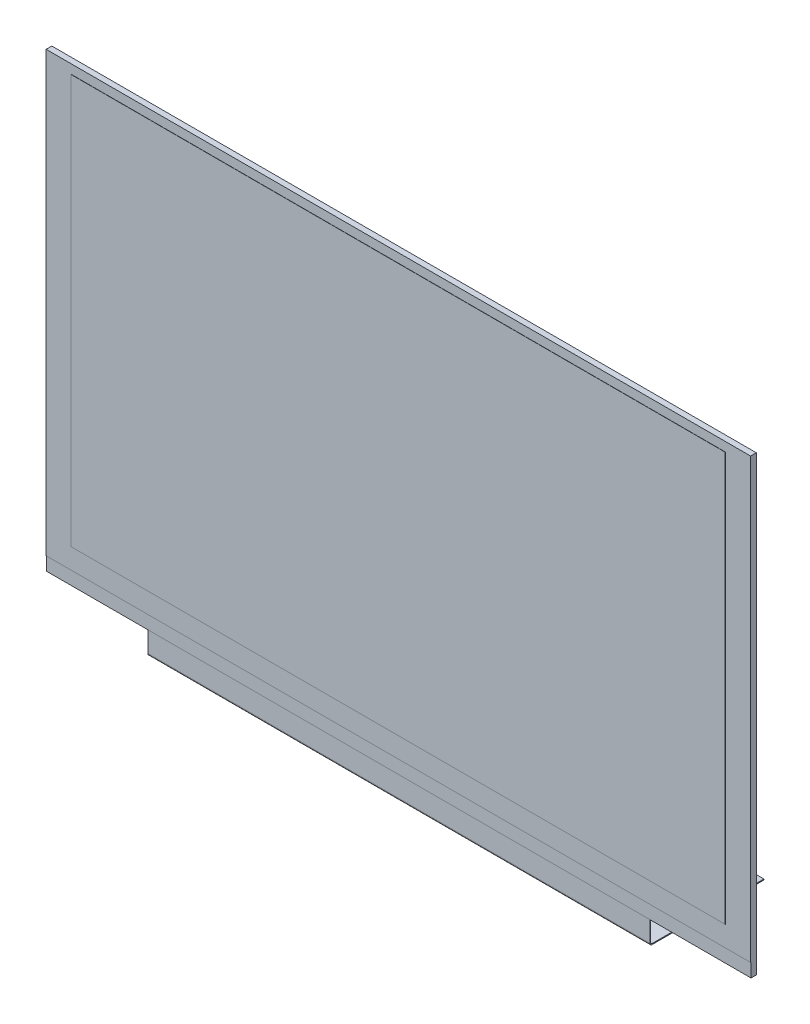
ISO-10303-21;
HEADER;
FILE_DESCRIPTION(('STEP AP214'),'2;1');
FILE_NAME('part.step','',(''),(''),'','','');
FILE_SCHEMA(('AUTOMOTIVE_DESIGN { 1 0 10303 214 1 1 1 1 }'));
ENDSEC;
DATA;
#1=APPLICATION_CONTEXT('core data for automotive mechanical design processes');
#2=APPLICATION_PROTOCOL_DEFINITION('international standard','automotive_design',2000,#1);
#3=PRODUCT_CONTEXT('',#1,'mechanical');
#4=PRODUCT('Part','Part','',(#3));
#5=PRODUCT_RELATED_PRODUCT_CATEGORY('part','',(#4));
#6=PRODUCT_DEFINITION_FORMATION('','',#4);
#7=PRODUCT_DEFINITION_CONTEXT('part definition',#1,'design');
#8=PRODUCT_DEFINITION('design','',#6,#7);
#9=PRODUCT_DEFINITION_SHAPE('','',#8);
#10=(LENGTH_UNIT() NAMED_UNIT(*) SI_UNIT(.MILLI.,.METRE.));
#11=(NAMED_UNIT(*) PLANE_ANGLE_UNIT() SI_UNIT($,.RADIAN.));
#12=(NAMED_UNIT(*) SI_UNIT($,.STERADIAN.) SOLID_ANGLE_UNIT());
#13=UNCERTAINTY_MEASURE_WITH_UNIT(LENGTH_MEASURE(1.E-05),#10,'distance_accuracy_value','');
#14=(GEOMETRIC_REPRESENTATION_CONTEXT(3) GLOBAL_UNCERTAINTY_ASSIGNED_CONTEXT((#13)) GLOBAL_UNIT_ASSIGNED_CONTEXT((#10,
#11,#12)) REPRESENTATION_CONTEXT('',''));
#15=CARTESIAN_POINT('',(0.,0.,0.));
#16=DIRECTION('',(0.,0.,1.));
#17=DIRECTION('',(1.,0.,0.));
#18=AXIS2_PLACEMENT_3D('',#15,#16,#17);
#19=CARTESIAN_POINT('',(-55.,-54.05,0.649999999999999));
#20=DIRECTION('',(1.,0.,0.));
#21=DIRECTION('',(0.,0.,-1.));
#22=AXIS2_PLACEMENT_3D('',#19,#20,#21);
#23=CYLINDRICAL_SURFACE('',#22,0.3);
#24=DIRECTION('',(1.,0.,0.));
#25=VECTOR('',#24,1.);
#26=CARTESIAN_POINT('',(-55.,-54.35,0.65));
#27=LINE('',#26,#25);
#28=CARTESIAN_POINT('',(55.,-54.35,0.65));
#29=VERTEX_POINT('',#28);
#30=CARTESIAN_POINT('',(-55.,-54.35,0.65));
#31=VERTEX_POINT('',#30);
#32=EDGE_CURVE('P0_E131',#29,#31,#27,.F.);
#33=ORIENTED_EDGE('',*,*,#32,.T.);
#34=CARTESIAN_POINT('',(-55.,-54.05,0.649999999999999));
#35=DIRECTION('',(1.,0.,0.));
#36=DIRECTION('',(0.,0.,-1.));
#37=AXIS2_PLACEMENT_3D('',#34,#35,#36);
#38=CIRCLE('',#37,0.3);
#39=CARTESIAN_POINT('',(-55.,-54.05,0.95));
#40=VERTEX_POINT('',#39);
#41=EDGE_CURVE('P0_E19',#40,#31,#38,.T.);
#42=ORIENTED_EDGE('',*,*,#41,.F.);
#43=DIRECTION('',(1.,0.,0.));
#44=VECTOR('',#43,1.);
#45=CARTESIAN_POINT('',(-55.,-54.05,0.95));
#46=LINE('',#45,#44);
#47=CARTESIAN_POINT('',(55.,-54.05,0.95));
#48=VERTEX_POINT('',#47);
#49=EDGE_CURVE('P0_E191',#40,#48,#46,.T.);
#50=ORIENTED_EDGE('',*,*,#49,.T.);
#51=CARTESIAN_POINT('',(55.,-54.05,0.649999999999999));
#52=DIRECTION('',(1.,0.,0.));
#53=DIRECTION('',(0.,0.,-1.));
#54=AXIS2_PLACEMENT_3D('',#51,#52,#53);
#55=CIRCLE('',#54,0.3);
#56=EDGE_CURVE('P0_E235',#29,#48,#55,.F.);
#57=ORIENTED_EDGE('',*,*,#56,.F.);
#58=EDGE_LOOP('',(#33,#42,#50,#57));
#59=FACE_BOUND('',#58,.T.);
#60=ADVANCED_FACE('P0_F16',(#59),#23,.F.);
#61=CARTESIAN_POINT('',(-52.5,-53.05,-23.85));
#62=DIRECTION('',(-1.,0.,0.));
#63=DIRECTION('',(0.,0.,1.));
#64=AXIS2_PLACEMENT_3D('',#61,#62,#63);
#65=PLANE('',#64);
#66=DIRECTION('',(0.,1.,0.));
#67=VECTOR('',#66,1.);
#68=CARTESIAN_POINT('',(-52.5,-53.05,-19.85));
#69=LINE('',#68,#67);
#70=CARTESIAN_POINT('',(-52.5,-53.05,-19.85));
#71=VERTEX_POINT('',#70);
#72=CARTESIAN_POINT('',(-52.5,-54.35,-19.85));
#73=VERTEX_POINT('',#72);
#74=EDGE_CURVE('P0_E223',#71,#73,#69,.F.);
#75=ORIENTED_EDGE('',*,*,#74,.F.);
#76=DIRECTION('',(0.,0.,-1.));
#77=VECTOR('',#76,1.);
#78=CARTESIAN_POINT('',(-52.5,-53.05,0.));
#79=LINE('',#78,#77);
#80=CARTESIAN_POINT('',(-52.5,-53.05,-23.85));
#81=VERTEX_POINT('',#80);
#82=EDGE_CURVE('P0_E240',#71,#81,#79,.T.);
#83=ORIENTED_EDGE('',*,*,#82,.T.);
#84=DIRECTION('',(0.,1.,0.));
#85=VECTOR('',#84,1.);
#86=CARTESIAN_POINT('',(-52.5,-53.05,-23.85));
#87=LINE('',#86,#85);
#88=CARTESIAN_POINT('',(-52.5,-54.35,-23.85));
#89=VERTEX_POINT('',#88);
#90=EDGE_CURVE('P0_E231',#81,#89,#87,.F.);
#91=ORIENTED_EDGE('',*,*,#90,.T.);
#92=DIRECTION('',(0.,0.,-1.));
#93=VECTOR('',#92,1.);
#94=CARTESIAN_POINT('',(-52.5,-54.35,0.649999999999999));
#95=LINE('',#94,#93);
#96=EDGE_CURVE('P0_E190',#89,#73,#95,.F.);
#97=ORIENTED_EDGE('',*,*,#96,.T.);
#98=EDGE_LOOP('',(#75,#83,#91,#97));
#99=FACE_BOUND('',#98,.T.);
#100=ADVANCED_FACE('P0_F383',(#99),#65,.T.);
#101=CARTESIAN_POINT('',(-27.5,-53.05,-19.85));
#102=DIRECTION('',(0.,0.,1.));
#103=DIRECTION('',(1.,0.,0.));
#104=AXIS2_PLACEMENT_3D('',#101,#102,#103);
#105=PLANE('',#104);
#106=DIRECTION('',(0.,1.,0.));
#107=VECTOR('',#106,1.);
#108=CARTESIAN_POINT('',(-27.5,-53.05,-19.85));
#109=LINE('',#108,#107);
#110=CARTESIAN_POINT('',(-27.5,-53.05,-19.85));
#111=VERTEX_POINT('',#110);
#112=CARTESIAN_POINT('',(-27.5,-54.35,-19.85));
#113=VERTEX_POINT('',#112);
#114=EDGE_CURVE('P0_E218',#111,#113,#109,.F.);
#115=ORIENTED_EDGE('',*,*,#114,.F.);
#116=DIRECTION('',(1.,0.,0.));
#117=VECTOR('',#116,1.);
#118=CARTESIAN_POINT('',(0.,-53.05,-19.85));
#119=LINE('',#118,#117);
#120=EDGE_CURVE('P0_E214',#111,#71,#119,.F.);
#121=ORIENTED_EDGE('',*,*,#120,.T.);
#122=ORIENTED_EDGE('',*,*,#74,.T.);
#123=DIRECTION('',(1.,0.,0.));
#124=VECTOR('',#123,1.);
#125=CARTESIAN_POINT('',(-55.,-54.35,-19.85));
#126=LINE('',#125,#124);
#127=EDGE_CURVE('P0_E203',#73,#113,#126,.T.);
#128=ORIENTED_EDGE('',*,*,#127,.T.);
#129=EDGE_LOOP('',(#115,#121,#122,#128));
#130=FACE_BOUND('',#129,.T.);
#131=ADVANCED_FACE('P0_F374',(#130),#105,.T.);
#132=CARTESIAN_POINT('',(-27.5,-53.05,-23.85));
#133=DIRECTION('',(1.,0.,0.));
#134=DIRECTION('',(0.,0.,-1.));
#135=AXIS2_PLACEMENT_3D('',#132,#133,#134);
#136=PLANE('',#135);
#137=DIRECTION('',(0.,1.,0.));
#138=VECTOR('',#137,1.);
#139=CARTESIAN_POINT('',(-27.5,-53.05,-23.85));
#140=LINE('',#139,#138);
#141=CARTESIAN_POINT('',(-27.5,-54.35,-23.85));
#142=VERTEX_POINT('',#141);
#143=CARTESIAN_POINT('',(-27.5,-53.05,-23.85));
#144=VERTEX_POINT('',#143);
#145=EDGE_CURVE('P0_E139',#142,#144,#140,.T.);
#146=ORIENTED_EDGE('',*,*,#145,.T.);
#147=DIRECTION('',(0.,0.,-1.));
#148=VECTOR('',#147,1.);
#149=CARTESIAN_POINT('',(-27.5,-53.05,0.));
#150=LINE('',#149,#148);
#151=EDGE_CURVE('P0_E195',#144,#111,#150,.F.);
#152=ORIENTED_EDGE('',*,*,#151,.T.);
#153=ORIENTED_EDGE('',*,*,#114,.T.);
#154=DIRECTION('',(0.,0.,-1.));
#155=VECTOR('',#154,1.);
#156=CARTESIAN_POINT('',(-27.5,-54.35,0.649999999999999));
#157=LINE('',#156,#155);
#158=EDGE_CURVE('P0_E184',#113,#142,#157,.T.);
#159=ORIENTED_EDGE('',*,*,#158,.T.);
#160=EDGE_LOOP('',(#146,#152,#153,#159));
#161=FACE_BOUND('',#160,.T.);
#162=ADVANCED_FACE('P0_F366',(#161),#136,.T.);
#163=CARTESIAN_POINT('',(-55.,-49.55,1.15));
#164=DIRECTION('',(0.,-1.,0.));
#165=DIRECTION('',(0.,0.,-1.));
#166=AXIS2_PLACEMENT_3D('',#163,#164,#165);
#167=PLANE('',#166);
#168=DIRECTION('',(0.,0.,-1.));
#169=VECTOR('',#168,1.);
#170=CARTESIAN_POINT('',(-55.,-49.55,1.15));
#171=LINE('',#170,#169);
#172=CARTESIAN_POINT('',(-55.,-49.55,1.15));
#173=VERTEX_POINT('',#172);
#174=CARTESIAN_POINT('',(-55.,-49.55,0.95));
#175=VERTEX_POINT('',#174);
#176=EDGE_CURVE('P0_E69',#173,#175,#171,.T.);
#177=ORIENTED_EDGE('',*,*,#176,.F.);
#178=DIRECTION('',(1.,0.,0.));
#179=VECTOR('',#178,1.);
#180=CARTESIAN_POINT('',(-55.,-49.55,1.15));
#181=LINE('',#180,#179);
#182=CARTESIAN_POINT('',(55.,-49.55,1.15));
#183=VERTEX_POINT('',#182);
#184=EDGE_CURVE('P0_E177',#183,#173,#181,.F.);
#185=ORIENTED_EDGE('',*,*,#184,.F.);
#186=DIRECTION('',(0.,0.,-1.));
#187=VECTOR('',#186,1.);
#188=CARTESIAN_POINT('',(55.,-49.55,1.15));
#189=LINE('',#188,#187);
#190=CARTESIAN_POINT('',(55.,-49.55,0.95));
#191=VERTEX_POINT('',#190);
#192=EDGE_CURVE('P0_E209',#191,#183,#189,.F.);
#193=ORIENTED_EDGE('',*,*,#192,.F.);
#194=DIRECTION('',(1.,0.,0.));
#195=VECTOR('',#194,1.);
#196=CARTESIAN_POINT('',(-55.,-49.55,0.95));
#197=LINE('',#196,#195);
#198=EDGE_CURVE('P0_E193',#191,#175,#197,.F.);
#199=ORIENTED_EDGE('',*,*,#198,.T.);
#200=EDGE_LOOP('',(#177,#185,#193,#199));
#201=FACE_BOUND('',#200,.T.);
#202=ADVANCED_FACE('P0_F269',(#201),#167,.F.);
#203=CARTESIAN_POINT('',(0.,-53.05,0.));
#204=DIRECTION('',(0.,-1.,0.));
#205=DIRECTION('',(0.,0.,-1.));
#206=AXIS2_PLACEMENT_3D('',#203,#204,#205);
#207=PLANE('',#206);
#208=DIRECTION('',(-1.,0.,0.));
#209=VECTOR('',#208,1.);
#210=CARTESIAN_POINT('',(-27.5,-53.05,-23.85));
#211=LINE('',#210,#209);
#212=EDGE_CURVE('P0_E141',#81,#144,#211,.F.);
#213=ORIENTED_EDGE('',*,*,#212,.F.);
#214=ORIENTED_EDGE('',*,*,#82,.F.);
#215=ORIENTED_EDGE('',*,*,#120,.F.);
#216=ORIENTED_EDGE('',*,*,#151,.F.);
#217=EDGE_LOOP('',(#213,#214,#215,#216));
#218=FACE_BOUND('',#217,.T.);
#219=ADVANCED_FACE('P0_F280',(#218),#207,.F.);
#220=CARTESIAN_POINT('',(-55.,-49.55,0.95));
#221=DIRECTION('',(0.,0.,1.));
#222=DIRECTION('',(0.,-1.,0.));
#223=AXIS2_PLACEMENT_3D('',#220,#221,#222);
#224=PLANE('',#223);
#225=ORIENTED_EDGE('',*,*,#49,.F.);
#226=DIRECTION('',(0.,1.,0.));
#227=VECTOR('',#226,1.);
#228=CARTESIAN_POINT('',(-55.,-54.55,0.95));
#229=LINE('',#228,#227);
#230=EDGE_CURVE('P0_E170',#175,#40,#229,.F.);
#231=ORIENTED_EDGE('',*,*,#230,.F.);
#232=ORIENTED_EDGE('',*,*,#198,.F.);
#233=DIRECTION('',(0.,1.,0.));
#234=VECTOR('',#233,1.);
#235=CARTESIAN_POINT('',(55.,-49.55,0.95));
#236=LINE('',#235,#234);
#237=EDGE_CURVE('P0_E134',#191,#48,#236,.F.);
#238=ORIENTED_EDGE('',*,*,#237,.T.);
#239=EDGE_LOOP('',(#225,#231,#232,#238));
#240=FACE_BOUND('',#239,.T.);
#241=ADVANCED_FACE('P0_F271',(#240),#224,.F.);
#242=CARTESIAN_POINT('',(-55.,-54.35,0.649999999999999));
#243=DIRECTION('',(0.,-1.,0.));
#244=DIRECTION('',(0.,0.,-1.));
#245=AXIS2_PLACEMENT_3D('',#242,#243,#244);
#246=PLANE('',#245);
#247=ORIENTED_EDGE('',*,*,#127,.F.);
#248=ORIENTED_EDGE('',*,*,#96,.F.);
#249=DIRECTION('',(-1.,0.,0.));
#250=VECTOR('',#249,1.);
#251=CARTESIAN_POINT('',(-27.5,-54.35,-23.85));
#252=LINE('',#251,#250);
#253=CARTESIAN_POINT('',(-55.,-54.35,-23.85));
#254=VERTEX_POINT('',#253);
#255=EDGE_CURVE('P0_E169',#254,#89,#252,.F.);
#256=ORIENTED_EDGE('',*,*,#255,.F.);
#257=DIRECTION('',(0.,0.,1.));
#258=VECTOR('',#257,1.);
#259=CARTESIAN_POINT('',(-55.,-54.35,0.649999999999999));
#260=LINE('',#259,#258);
#261=EDGE_CURVE('P0_E167',#31,#254,#260,.F.);
#262=ORIENTED_EDGE('',*,*,#261,.F.);
#263=ORIENTED_EDGE('',*,*,#32,.F.);
#264=DIRECTION('',(0.,0.,1.));
#265=VECTOR('',#264,1.);
#266=CARTESIAN_POINT('',(55.,-54.35,1.15));
#267=LINE('',#266,#265);
#268=CARTESIAN_POINT('',(55.,-54.35,-23.85));
#269=VERTEX_POINT('',#268);
#270=EDGE_CURVE('P0_E124',#29,#269,#267,.F.);
#271=ORIENTED_EDGE('',*,*,#270,.T.);
#272=DIRECTION('',(-1.,0.,0.));
#273=VECTOR('',#272,1.);
#274=CARTESIAN_POINT('',(-27.5,-54.35,-23.85));
#275=LINE('',#274,#273);
#276=EDGE_CURVE('P0_E129',#142,#269,#275,.F.);
#277=ORIENTED_EDGE('',*,*,#276,.F.);
#278=ORIENTED_EDGE('',*,*,#158,.F.);
#279=EDGE_LOOP('',(#247,#248,#256,#262,#263,#271,#277,#278));
#280=FACE_BOUND('',#279,.T.);
#281=ADVANCED_FACE('P0_F127',(#280),#246,.F.);
#282=CARTESIAN_POINT('',(-55.,-49.55,1.15));
#283=DIRECTION('',(0.,0.,1.));
#284=DIRECTION('',(0.,-1.,0.));
#285=AXIS2_PLACEMENT_3D('',#282,#283,#284);
#286=PLANE('',#285);
#287=DIRECTION('',(0.,1.,0.));
#288=VECTOR('',#287,1.);
#289=CARTESIAN_POINT('',(-55.,-54.55,1.15));
#290=LINE('',#289,#288);
#291=CARTESIAN_POINT('',(-55.,-54.05,1.15));
#292=VERTEX_POINT('',#291);
#293=EDGE_CURVE('P0_E107',#292,#173,#290,.T.);
#294=ORIENTED_EDGE('',*,*,#293,.F.);
#295=DIRECTION('',(1.,0.,0.));
#296=VECTOR('',#295,1.);
#297=CARTESIAN_POINT('',(-55.,-54.05,1.15));
#298=LINE('',#297,#296);
#299=CARTESIAN_POINT('',(55.,-54.05,1.15));
#300=VERTEX_POINT('',#299);
#301=EDGE_CURVE('P0_E180',#300,#292,#298,.F.);
#302=ORIENTED_EDGE('',*,*,#301,.F.);
#303=DIRECTION('',(0.,1.,0.));
#304=VECTOR('',#303,1.);
#305=CARTESIAN_POINT('',(55.,-49.55,1.15));
#306=LINE('',#305,#304);
#307=EDGE_CURVE('P0_E146',#300,#183,#306,.T.);
#308=ORIENTED_EDGE('',*,*,#307,.T.);
#309=ORIENTED_EDGE('',*,*,#184,.T.);
#310=EDGE_LOOP('',(#294,#302,#308,#309));
#311=FACE_BOUND('',#310,.T.);
#312=ADVANCED_FACE('P0_F264',(#311),#286,.T.);
#313=CARTESIAN_POINT('',(-55.,-54.55,0.649999999999999));
#314=DIRECTION('',(-1.,0.,0.));
#315=DIRECTION('',(0.,0.,1.));
#316=AXIS2_PLACEMENT_3D('',#313,#314,#315);
#317=PLANE('',#316);
#318=ORIENTED_EDGE('',*,*,#261,.T.);
#319=DIRECTION('',(0.,1.,0.));
#320=VECTOR('',#319,1.);
#321=CARTESIAN_POINT('',(-55.,-53.05,-23.85));
#322=LINE('',#321,#320);
#323=CARTESIAN_POINT('',(-55.,-54.55,-23.85));
#324=VERTEX_POINT('',#323);
#325=EDGE_CURVE('P0_E117',#324,#254,#322,.T.);
#326=ORIENTED_EDGE('',*,*,#325,.F.);
#327=DIRECTION('',(0.,0.,-1.));
#328=VECTOR('',#327,1.);
#329=CARTESIAN_POINT('',(-55.,-54.55,0.));
#330=LINE('',#329,#328);
#331=CARTESIAN_POINT('',(-55.,-54.55,0.649999999999999));
#332=VERTEX_POINT('',#331);
#333=EDGE_CURVE('P0_E112',#332,#324,#330,.T.);
#334=ORIENTED_EDGE('',*,*,#333,.F.);
#335=CARTESIAN_POINT('',(-55.,-54.05,0.649999999999999));
#336=DIRECTION('',(1.,0.,0.));
#337=DIRECTION('',(0.,0.,-1.));
#338=AXIS2_PLACEMENT_3D('',#335,#336,#337);
#339=CIRCLE('',#338,0.5);
#340=EDGE_CURVE('P0_E164',#292,#332,#339,.T.);
#341=ORIENTED_EDGE('',*,*,#340,.F.);
#342=ORIENTED_EDGE('',*,*,#293,.T.);
#343=ORIENTED_EDGE('',*,*,#176,.T.);
#344=ORIENTED_EDGE('',*,*,#230,.T.);
#345=ORIENTED_EDGE('',*,*,#41,.T.);
#346=EDGE_LOOP('',(#318,#326,#334,#341,#342,#343,#344,#345));
#347=FACE_BOUND('',#346,.T.);
#348=ADVANCED_FACE('P0_F256',(#347),#317,.T.);
#349=CARTESIAN_POINT('',(-27.5,-53.05,-23.85));
#350=DIRECTION('',(0.,0.,-1.));
#351=DIRECTION('',(-1.,0.,0.));
#352=AXIS2_PLACEMENT_3D('',#349,#350,#351);
#353=PLANE('',#352);
#354=DIRECTION('',(1.,0.,0.));
#355=VECTOR('',#354,1.);
#356=CARTESIAN_POINT('',(0.,-54.55,-23.85));
#357=LINE('',#356,#355);
#358=CARTESIAN_POINT('',(55.,-54.55,-23.85));
#359=VERTEX_POINT('',#358);
#360=EDGE_CURVE('P0_E156',#324,#359,#357,.T.);
#361=ORIENTED_EDGE('',*,*,#360,.F.);
#362=ORIENTED_EDGE('',*,*,#325,.T.);
#363=ORIENTED_EDGE('',*,*,#255,.T.);
#364=ORIENTED_EDGE('',*,*,#90,.F.);
#365=ORIENTED_EDGE('',*,*,#212,.T.);
#366=ORIENTED_EDGE('',*,*,#145,.F.);
#367=ORIENTED_EDGE('',*,*,#276,.T.);
#368=DIRECTION('',(0.,1.,0.));
#369=VECTOR('',#368,1.);
#370=CARTESIAN_POINT('',(55.,-49.55,-23.85));
#371=LINE('',#370,#369);
#372=EDGE_CURVE('P0_E133',#269,#359,#371,.F.);
#373=ORIENTED_EDGE('',*,*,#372,.T.);
#374=EDGE_LOOP('',(#361,#362,#363,#364,#365,#366,#367,#373));
#375=FACE_BOUND('',#374,.T.);
#376=ADVANCED_FACE('P0_F137',(#375),#353,.T.);
#377=CARTESIAN_POINT('',(55.,-49.55,1.15));
#378=DIRECTION('',(-1.,0.,0.));
#379=DIRECTION('',(0.,0.,1.));
#380=AXIS2_PLACEMENT_3D('',#377,#378,#379);
#381=PLANE('',#380);
#382=CARTESIAN_POINT('',(55.,-54.05,0.649999999999999));
#383=DIRECTION('',(1.,0.,0.));
#384=DIRECTION('',(0.,0.,-1.));
#385=AXIS2_PLACEMENT_3D('',#382,#383,#384);
#386=CIRCLE('',#385,0.5);
#387=CARTESIAN_POINT('',(55.,-54.55,0.649999999999999));
#388=VERTEX_POINT('',#387);
#389=EDGE_CURVE('P0_E34',#388,#300,#386,.F.);
#390=ORIENTED_EDGE('',*,*,#389,.F.);
#391=DIRECTION('',(0.,0.,-1.));
#392=VECTOR('',#391,1.);
#393=CARTESIAN_POINT('',(55.,-54.55,0.));
#394=LINE('',#393,#392);
#395=EDGE_CURVE('P0_E25',#359,#388,#394,.F.);
#396=ORIENTED_EDGE('',*,*,#395,.F.);
#397=ORIENTED_EDGE('',*,*,#372,.F.);
#398=ORIENTED_EDGE('',*,*,#270,.F.);
#399=ORIENTED_EDGE('',*,*,#56,.T.);
#400=ORIENTED_EDGE('',*,*,#237,.F.);
#401=ORIENTED_EDGE('',*,*,#192,.T.);
#402=ORIENTED_EDGE('',*,*,#307,.F.);
#403=EDGE_LOOP('',(#390,#396,#397,#398,#399,#400,#401,#402));
#404=FACE_BOUND('',#403,.T.);
#405=ADVANCED_FACE('P0_F143',(#404),#381,.F.);
#406=CARTESIAN_POINT('',(-55.,-54.05,0.649999999999999));
#407=DIRECTION('',(1.,0.,0.));
#408=DIRECTION('',(0.,0.,-1.));
#409=AXIS2_PLACEMENT_3D('',#406,#407,#408);
#410=CYLINDRICAL_SURFACE('',#409,0.5);
#411=ORIENTED_EDGE('',*,*,#340,.T.);
#412=DIRECTION('',(1.,0.,0.));
#413=VECTOR('',#412,1.);
#414=CARTESIAN_POINT('',(0.,-54.55,0.649999999999999));
#415=LINE('',#414,#413);
#416=EDGE_CURVE('P0_E11',#388,#332,#415,.F.);
#417=ORIENTED_EDGE('',*,*,#416,.F.);
#418=ORIENTED_EDGE('',*,*,#389,.T.);
#419=ORIENTED_EDGE('',*,*,#301,.T.);
#420=EDGE_LOOP('',(#411,#417,#418,#419));
#421=FACE_BOUND('',#420,.T.);
#422=ADVANCED_FACE('P0_F263',(#421),#410,.T.);
#423=CARTESIAN_POINT('',(0.,-54.55,0.));
#424=DIRECTION('',(0.,-1.,0.));
#425=DIRECTION('',(0.,0.,-1.));
#426=AXIS2_PLACEMENT_3D('',#423,#424,#425);
#427=PLANE('',#426);
#428=ORIENTED_EDGE('',*,*,#395,.T.);
#429=ORIENTED_EDGE('',*,*,#416,.T.);
#430=ORIENTED_EDGE('',*,*,#333,.T.);
#431=ORIENTED_EDGE('',*,*,#360,.T.);
#432=EDGE_LOOP('',(#428,#429,#430,#431));
#433=FACE_BOUND('',#432,.T.);
#434=ADVANCED_FACE('P0_F261',(#433),#427,.T.);
#435=CLOSED_SHELL('',(#60,#100,#131,#162,#202,#219,#241,#281,#312,#348,#376,#405,#422,#434));
#436=MANIFOLD_SOLID_BREP('P0_B1',#435);
#437=CARTESIAN_POINT('',(0.,0.,1.3));
#438=DIRECTION('',(0.,0.,1.));
#439=DIRECTION('',(1.,0.,0.));
#440=AXIS2_PLACEMENT_3D('',#437,#438,#439);
#441=PLANE('',#440);
#442=DIRECTION('',(0.,-1.,0.));
#443=VECTOR('',#442,1.);
#444=CARTESIAN_POINT('',(71.68,47.55,1.3));
#445=LINE('',#444,#443);
#446=CARTESIAN_POINT('',(71.68,-42.05,1.3));
#447=VERTEX_POINT('',#446);
#448=CARTESIAN_POINT('',(71.68,47.55,1.3));
#449=VERTEX_POINT('',#448);
#450=EDGE_CURVE('P1_E110',#447,#449,#445,.F.);
#451=ORIENTED_EDGE('',*,*,#450,.T.);
#452=DIRECTION('',(1.,0.,0.));
#453=VECTOR('',#452,1.);
#454=CARTESIAN_POINT('',(-71.68,47.55,1.3));
#455=LINE('',#454,#453);
#456=CARTESIAN_POINT('',(-71.68,47.55,1.3));
#457=VERTEX_POINT('',#456);
#458=EDGE_CURVE('P1_E91',#449,#457,#455,.F.);
#459=ORIENTED_EDGE('',*,*,#458,.T.);
#460=DIRECTION('',(0.,1.,0.));
#461=VECTOR('',#460,1.);
#462=CARTESIAN_POINT('',(-71.68,47.55,1.3));
#463=LINE('',#462,#461);
#464=CARTESIAN_POINT('',(-71.68,-42.05,1.3));
#465=VERTEX_POINT('',#464);
#466=EDGE_CURVE('P1_E98',#457,#465,#463,.F.);
#467=ORIENTED_EDGE('',*,*,#466,.T.);
#468=DIRECTION('',(1.,0.,0.));
#469=VECTOR('',#468,1.);
#470=CARTESIAN_POINT('',(-71.68,-42.05,1.3));
#471=LINE('',#470,#469);
#472=EDGE_CURVE('P1_E159',#465,#447,#471,.T.);
#473=ORIENTED_EDGE('',*,*,#472,.T.);
#474=EDGE_LOOP('',(#451,#459,#467,#473));
#475=FACE_BOUND('',#474,.T.);
#476=ADVANCED_FACE('P1_F16',(#475),#441,.T.);
#477=CARTESIAN_POINT('',(-77.18,-46.55,1.25));
#478=DIRECTION('',(0.,1.,0.));
#479=DIRECTION('',(0.,0.,1.));
#480=AXIS2_PLACEMENT_3D('',#477,#478,#479);
#481=PLANE('',#480);
#482=DIRECTION('',(0.,0.,1.));
#483=VECTOR('',#482,1.);
#484=CARTESIAN_POINT('',(77.18,-46.55,1.25));
#485=LINE('',#484,#483);
#486=CARTESIAN_POINT('',(77.18,-46.55,1.25));
#487=VERTEX_POINT('',#486);
#488=CARTESIAN_POINT('',(77.18,-46.55,1.15));
#489=VERTEX_POINT('',#488);
#490=EDGE_CURVE('P1_E106',#487,#489,#485,.F.);
#491=ORIENTED_EDGE('',*,*,#490,.F.);
#492=DIRECTION('',(1.,0.,0.));
#493=VECTOR('',#492,1.);
#494=CARTESIAN_POINT('',(0.,-46.55,1.25));
#495=LINE('',#494,#493);
#496=CARTESIAN_POINT('',(-77.18,-46.55,1.25));
#497=VERTEX_POINT('',#496);
#498=EDGE_CURVE('P1_E130',#497,#487,#495,.T.);
#499=ORIENTED_EDGE('',*,*,#498,.F.);
#500=DIRECTION('',(0.,0.,1.));
#501=VECTOR('',#500,1.);
#502=CARTESIAN_POINT('',(-77.18,-46.55,1.25));
#503=LINE('',#502,#501);
#504=CARTESIAN_POINT('',(-77.18,-46.55,1.15));
#505=VERTEX_POINT('',#504);
#506=EDGE_CURVE('P1_E19',#505,#497,#503,.T.);
#507=ORIENTED_EDGE('',*,*,#506,.F.);
#508=DIRECTION('',(1.,0.,0.));
#509=VECTOR('',#508,1.);
#510=CARTESIAN_POINT('',(0.,-46.55,1.15));
#511=LINE('',#510,#509);
#512=EDGE_CURVE('P1_E135',#489,#505,#511,.F.);
#513=ORIENTED_EDGE('',*,*,#512,.F.);
#514=EDGE_LOOP('',(#491,#499,#507,#513));
#515=FACE_BOUND('',#514,.T.);
#516=ADVANCED_FACE('P1_F131',(#515),#481,.F.);
#517=CARTESIAN_POINT('',(-71.68,47.55,1.3));
#518=DIRECTION('',(1.,0.,0.));
#519=DIRECTION('',(0.,1.,0.));
#520=AXIS2_PLACEMENT_3D('',#517,#518,#519);
#521=PLANE('',#520);
#522=DIRECTION('',(0.,1.,0.));
#523=VECTOR('',#522,1.);
#524=CARTESIAN_POINT('',(-71.68,0.,1.25));
#525=LINE('',#524,#523);
#526=CARTESIAN_POINT('',(-71.68,-42.05,1.25));
#527=VERTEX_POINT('',#526);
#528=CARTESIAN_POINT('',(-71.68,47.55,1.25));
#529=VERTEX_POINT('',#528);
#530=EDGE_CURVE('P1_E134',#527,#529,#525,.T.);
#531=ORIENTED_EDGE('',*,*,#530,.F.);
#532=DIRECTION('',(0.,0.,1.));
#533=VECTOR('',#532,1.);
#534=CARTESIAN_POINT('',(-71.68,-42.05,1.3));
#535=LINE('',#534,#533);
#536=EDGE_CURVE('P1_E103',#527,#465,#535,.T.);
#537=ORIENTED_EDGE('',*,*,#536,.T.);
#538=ORIENTED_EDGE('',*,*,#466,.F.);
#539=DIRECTION('',(0.,0.,-1.));
#540=VECTOR('',#539,1.);
#541=CARTESIAN_POINT('',(-71.68,47.55,1.3));
#542=LINE('',#541,#540);
#543=EDGE_CURVE('P1_E101',#457,#529,#542,.T.);
#544=ORIENTED_EDGE('',*,*,#543,.T.);
#545=EDGE_LOOP('',(#531,#537,#538,#544));
#546=FACE_BOUND('',#545,.T.);
#547=ADVANCED_FACE('P1_F100',(#546),#521,.F.);
#548=CARTESIAN_POINT('',(-71.68,47.55,1.3));
#549=DIRECTION('',(0.,-1.,0.));
#550=DIRECTION('',(0.,0.,-1.));
#551=AXIS2_PLACEMENT_3D('',#548,#549,#550);
#552=PLANE('',#551);
#553=DIRECTION('',(1.,0.,0.));
#554=VECTOR('',#553,1.);
#555=CARTESIAN_POINT('',(0.,47.55,1.25));
#556=LINE('',#555,#554);
#557=CARTESIAN_POINT('',(71.68,47.55,1.25));
#558=VERTEX_POINT('',#557);
#559=EDGE_CURVE('P1_E109',#529,#558,#556,.T.);
#560=ORIENTED_EDGE('',*,*,#559,.F.);
#561=ORIENTED_EDGE('',*,*,#543,.F.);
#562=ORIENTED_EDGE('',*,*,#458,.F.);
#563=DIRECTION('',(0.,0.,1.));
#564=VECTOR('',#563,1.);
#565=CARTESIAN_POINT('',(71.68,47.55,1.3));
#566=LINE('',#565,#564);
#567=EDGE_CURVE('P1_E161',#449,#558,#566,.F.);
#568=ORIENTED_EDGE('',*,*,#567,.T.);
#569=EDGE_LOOP('',(#560,#561,#562,#568));
#570=FACE_BOUND('',#569,.T.);
#571=ADVANCED_FACE('P1_F108',(#570),#552,.F.);
#572=CARTESIAN_POINT('',(71.68,47.55,1.3));
#573=DIRECTION('',(-1.,0.,0.));
#574=DIRECTION('',(0.,-1.,0.));
#575=AXIS2_PLACEMENT_3D('',#572,#573,#574);
#576=PLANE('',#575);
#577=DIRECTION('',(0.,1.,0.));
#578=VECTOR('',#577,1.);
#579=CARTESIAN_POINT('',(71.68,0.,1.25));
#580=LINE('',#579,#578);
#581=CARTESIAN_POINT('',(71.68,-42.05,1.25));
#582=VERTEX_POINT('',#581);
#583=EDGE_CURVE('P1_E150',#558,#582,#580,.F.);
#584=ORIENTED_EDGE('',*,*,#583,.F.);
#585=ORIENTED_EDGE('',*,*,#567,.F.);
#586=ORIENTED_EDGE('',*,*,#450,.F.);
#587=DIRECTION('',(0.,0.,1.));
#588=VECTOR('',#587,1.);
#589=CARTESIAN_POINT('',(71.68,-42.05,1.3));
#590=LINE('',#589,#588);
#591=EDGE_CURVE('P1_E156',#447,#582,#590,.F.);
#592=ORIENTED_EDGE('',*,*,#591,.T.);
#593=EDGE_LOOP('',(#584,#585,#586,#592));
#594=FACE_BOUND('',#593,.T.);
#595=ADVANCED_FACE('P1_F164',(#594),#576,.F.);
#596=CARTESIAN_POINT('',(-71.68,-42.05,1.3));
#597=DIRECTION('',(0.,1.,0.));
#598=DIRECTION('',(0.,0.,1.));
#599=AXIS2_PLACEMENT_3D('',#596,#597,#598);
#600=PLANE('',#599);
#601=DIRECTION('',(1.,0.,0.));
#602=VECTOR('',#601,1.);
#603=CARTESIAN_POINT('',(0.,-42.05,1.25));
#604=LINE('',#603,#602);
#605=EDGE_CURVE('P1_E147',#582,#527,#604,.F.);
#606=ORIENTED_EDGE('',*,*,#605,.F.);
#607=ORIENTED_EDGE('',*,*,#591,.F.);
#608=ORIENTED_EDGE('',*,*,#472,.F.);
#609=ORIENTED_EDGE('',*,*,#536,.F.);
#610=EDGE_LOOP('',(#606,#607,#608,#609));
#611=FACE_BOUND('',#610,.T.);
#612=ADVANCED_FACE('P1_F169',(#611),#600,.F.);
#613=CARTESIAN_POINT('',(0.,0.,1.15));
#614=DIRECTION('',(0.,0.,1.));
#615=DIRECTION('',(1.,0.,0.));
#616=AXIS2_PLACEMENT_3D('',#613,#614,#615);
#617=PLANE('',#616);
#618=DIRECTION('',(0.,1.,0.));
#619=VECTOR('',#618,1.);
#620=CARTESIAN_POINT('',(-77.18,-24.83,1.15));
#621=LINE('',#620,#619);
#622=CARTESIAN_POINT('',(-77.18,-49.55,1.15));
#623=VERTEX_POINT('',#622);
#624=EDGE_CURVE('P1_E126',#505,#623,#621,.F.);
#625=ORIENTED_EDGE('',*,*,#624,.T.);
#626=DIRECTION('',(1.,0.,0.));
#627=VECTOR('',#626,1.);
#628=CARTESIAN_POINT('',(-77.18,-49.55,1.15));
#629=LINE('',#628,#627);
#630=CARTESIAN_POINT('',(77.18,-49.55,1.15));
#631=VERTEX_POINT('',#630);
#632=EDGE_CURVE('P1_E315',#623,#631,#629,.T.);
#633=ORIENTED_EDGE('',*,*,#632,.T.);
#634=DIRECTION('',(0.,1.,0.));
#635=VECTOR('',#634,1.);
#636=CARTESIAN_POINT('',(77.18,49.55,1.15));
#637=LINE('',#636,#635);
#638=EDGE_CURVE('P1_E311',#631,#489,#637,.T.);
#639=ORIENTED_EDGE('',*,*,#638,.T.);
#640=ORIENTED_EDGE('',*,*,#512,.T.);
#641=EDGE_LOOP('',(#625,#633,#639,#640));
#642=FACE_BOUND('',#641,.T.);
#643=ADVANCED_FACE('P1_F171',(#642),#617,.T.);
#644=CARTESIAN_POINT('',(0.,0.,1.25));
#645=DIRECTION('',(0.,0.,1.));
#646=DIRECTION('',(1.,0.,0.));
#647=AXIS2_PLACEMENT_3D('',#644,#645,#646);
#648=PLANE('',#647);
#649=ORIENTED_EDGE('',*,*,#583,.T.);
#650=ORIENTED_EDGE('',*,*,#605,.T.);
#651=ORIENTED_EDGE('',*,*,#530,.T.);
#652=ORIENTED_EDGE('',*,*,#559,.T.);
#653=EDGE_LOOP('',(#649,#650,#651,#652));
#654=FACE_BOUND('',#653,.T.);
#655=DIRECTION('',(0.,1.,0.));
#656=VECTOR('',#655,1.);
#657=CARTESIAN_POINT('',(77.18,49.55,1.25));
#658=LINE('',#657,#656);
#659=CARTESIAN_POINT('',(77.18,49.55,1.25));
#660=VERTEX_POINT('',#659);
#661=EDGE_CURVE('P1_E309',#487,#660,#658,.T.);
#662=ORIENTED_EDGE('',*,*,#661,.T.);
#663=DIRECTION('',(1.,0.,0.));
#664=VECTOR('',#663,1.);
#665=CARTESIAN_POINT('',(-77.18,49.55,1.25));
#666=LINE('',#665,#664);
#667=CARTESIAN_POINT('',(-77.18,49.55,1.25));
#668=VERTEX_POINT('',#667);
#669=EDGE_CURVE('P1_E138',#660,#668,#666,.F.);
#670=ORIENTED_EDGE('',*,*,#669,.T.);
#671=DIRECTION('',(0.,1.,0.));
#672=VECTOR('',#671,1.);
#673=CARTESIAN_POINT('',(-77.18,-24.83,1.25));
#674=LINE('',#673,#672);
#675=EDGE_CURVE('P1_E124',#668,#497,#674,.F.);
#676=ORIENTED_EDGE('',*,*,#675,.T.);
#677=ORIENTED_EDGE('',*,*,#498,.T.);
#678=EDGE_LOOP('',(#662,#670,#676,#677));
#679=FACE_BOUND('',#678,.T.);
#680=ADVANCED_FACE('P1_F137',(#654,#679),#648,.T.);
#681=CARTESIAN_POINT('',(-77.18,49.55,1.15));
#682=DIRECTION('',(0.,-1.,0.));
#683=DIRECTION('',(0.,0.,-1.));
#684=AXIS2_PLACEMENT_3D('',#681,#682,#683);
#685=PLANE('',#684);
#686=DIRECTION('',(0.,0.,1.));
#687=VECTOR('',#686,1.);
#688=CARTESIAN_POINT('',(-77.18,49.55,1.15));
#689=LINE('',#688,#687);
#690=CARTESIAN_POINT('',(-77.18,49.55,0.));
#691=VERTEX_POINT('',#690);
#692=EDGE_CURVE('P1_E139',#691,#668,#689,.T.);
#693=ORIENTED_EDGE('',*,*,#692,.T.);
#694=ORIENTED_EDGE('',*,*,#669,.F.);
#695=DIRECTION('',(0.,0.,1.));
#696=VECTOR('',#695,1.);
#697=CARTESIAN_POINT('',(77.18,49.55,1.15));
#698=LINE('',#697,#696);
#699=CARTESIAN_POINT('',(77.18,49.55,0.));
#700=VERTEX_POINT('',#699);
#701=EDGE_CURVE('P1_E305',#660,#700,#698,.F.);
#702=ORIENTED_EDGE('',*,*,#701,.T.);
#703=DIRECTION('',(1.,0.,0.));
#704=VECTOR('',#703,1.);
#705=CARTESIAN_POINT('',(0.,49.55,0.));
#706=LINE('',#705,#704);
#707=EDGE_CURVE('P1_E298',#700,#691,#706,.F.);
#708=ORIENTED_EDGE('',*,*,#707,.T.);
#709=EDGE_LOOP('',(#693,#694,#702,#708));
#710=FACE_BOUND('',#709,.T.);
#711=ADVANCED_FACE('P1_F198',(#710),#685,.F.);
#712=CARTESIAN_POINT('',(-77.18,-24.83,1.15));
#713=DIRECTION('',(1.,0.,0.));
#714=DIRECTION('',(0.,1.,0.));
#715=AXIS2_PLACEMENT_3D('',#712,#713,#714);
#716=PLANE('',#715);
#717=DIRECTION('',(0.,0.,1.));
#718=VECTOR('',#717,1.);
#719=CARTESIAN_POINT('',(-77.18,-49.55,1.15));
#720=LINE('',#719,#718);
#721=CARTESIAN_POINT('',(-77.18,-49.55,0.));
#722=VERTEX_POINT('',#721);
#723=EDGE_CURVE('P1_E141',#722,#623,#720,.T.);
#724=ORIENTED_EDGE('',*,*,#723,.T.);
#725=ORIENTED_EDGE('',*,*,#624,.F.);
#726=ORIENTED_EDGE('',*,*,#506,.T.);
#727=ORIENTED_EDGE('',*,*,#675,.F.);
#728=ORIENTED_EDGE('',*,*,#692,.F.);
#729=DIRECTION('',(0.,1.,0.));
#730=VECTOR('',#729,1.);
#731=CARTESIAN_POINT('',(-77.18,0.,0.));
#732=LINE('',#731,#730);
#733=EDGE_CURVE('P1_E301',#691,#722,#732,.F.);
#734=ORIENTED_EDGE('',*,*,#733,.T.);
#735=EDGE_LOOP('',(#724,#725,#726,#727,#728,#734));
#736=FACE_BOUND('',#735,.T.);
#737=ADVANCED_FACE('P1_F122',(#736),#716,.F.);
#738=CARTESIAN_POINT('',(-77.18,-49.55,1.15));
#739=DIRECTION('',(0.,1.,0.));
#740=DIRECTION('',(0.,0.,1.));
#741=AXIS2_PLACEMENT_3D('',#738,#739,#740);
#742=PLANE('',#741);
#743=DIRECTION('',(0.,0.,1.));
#744=VECTOR('',#743,1.);
#745=CARTESIAN_POINT('',(77.18,-49.55,1.15));
#746=LINE('',#745,#744);
#747=CARTESIAN_POINT('',(77.18,-49.55,0.));
#748=VERTEX_POINT('',#747);
#749=EDGE_CURVE('P1_E33',#748,#631,#746,.T.);
#750=ORIENTED_EDGE('',*,*,#749,.T.);
#751=ORIENTED_EDGE('',*,*,#632,.F.);
#752=ORIENTED_EDGE('',*,*,#723,.F.);
#753=DIRECTION('',(1.,0.,0.));
#754=VECTOR('',#753,1.);
#755=CARTESIAN_POINT('',(0.,-49.55,0.));
#756=LINE('',#755,#754);
#757=EDGE_CURVE('P1_E25',#722,#748,#756,.T.);
#758=ORIENTED_EDGE('',*,*,#757,.T.);
#759=EDGE_LOOP('',(#750,#751,#752,#758));
#760=FACE_BOUND('',#759,.T.);
#761=ADVANCED_FACE('P1_F189',(#760),#742,.F.);
#762=CARTESIAN_POINT('',(77.18,49.55,1.15));
#763=DIRECTION('',(-1.,0.,0.));
#764=DIRECTION('',(0.,0.,1.));
#765=AXIS2_PLACEMENT_3D('',#762,#763,#764);
#766=PLANE('',#765);
#767=ORIENTED_EDGE('',*,*,#701,.F.);
#768=ORIENTED_EDGE('',*,*,#661,.F.);
#769=ORIENTED_EDGE('',*,*,#490,.T.);
#770=ORIENTED_EDGE('',*,*,#638,.F.);
#771=ORIENTED_EDGE('',*,*,#749,.F.);
#772=DIRECTION('',(0.,1.,0.));
#773=VECTOR('',#772,1.);
#774=CARTESIAN_POINT('',(77.18,0.,0.));
#775=LINE('',#774,#773);
#776=EDGE_CURVE('P1_E11',#748,#700,#775,.T.);
#777=ORIENTED_EDGE('',*,*,#776,.T.);
#778=EDGE_LOOP('',(#767,#768,#769,#770,#771,#777));
#779=FACE_BOUND('',#778,.T.);
#780=ADVANCED_FACE('P1_F183',(#779),#766,.F.);
#781=CARTESIAN_POINT('',(0.,0.,0.));
#782=DIRECTION('',(0.,0.,1.));
#783=DIRECTION('',(1.,0.,0.));
#784=AXIS2_PLACEMENT_3D('',#781,#782,#783);
#785=PLANE('',#784);
#786=ORIENTED_EDGE('',*,*,#757,.F.);
#787=ORIENTED_EDGE('',*,*,#733,.F.);
#788=ORIENTED_EDGE('',*,*,#707,.F.);
#789=ORIENTED_EDGE('',*,*,#776,.F.);
#790=EDGE_LOOP('',(#786,#787,#788,#789));
#791=FACE_BOUND('',#790,.T.);
#792=ADVANCED_FACE('P1_F181',(#791),#785,.F.);
#793=CLOSED_SHELL('',(#476,#516,#547,#571,#595,#612,#643,#680,#711,#737,#761,#780,#792));
#794=MANIFOLD_SOLID_BREP('P1_B1',#793);
#795=ADVANCED_BREP_SHAPE_REPRESENTATION('',(#18,#436,#794),#14);
#796=SHAPE_DEFINITION_REPRESENTATION(#9,#795);
ENDSEC;
END-ISO-10303-21;
